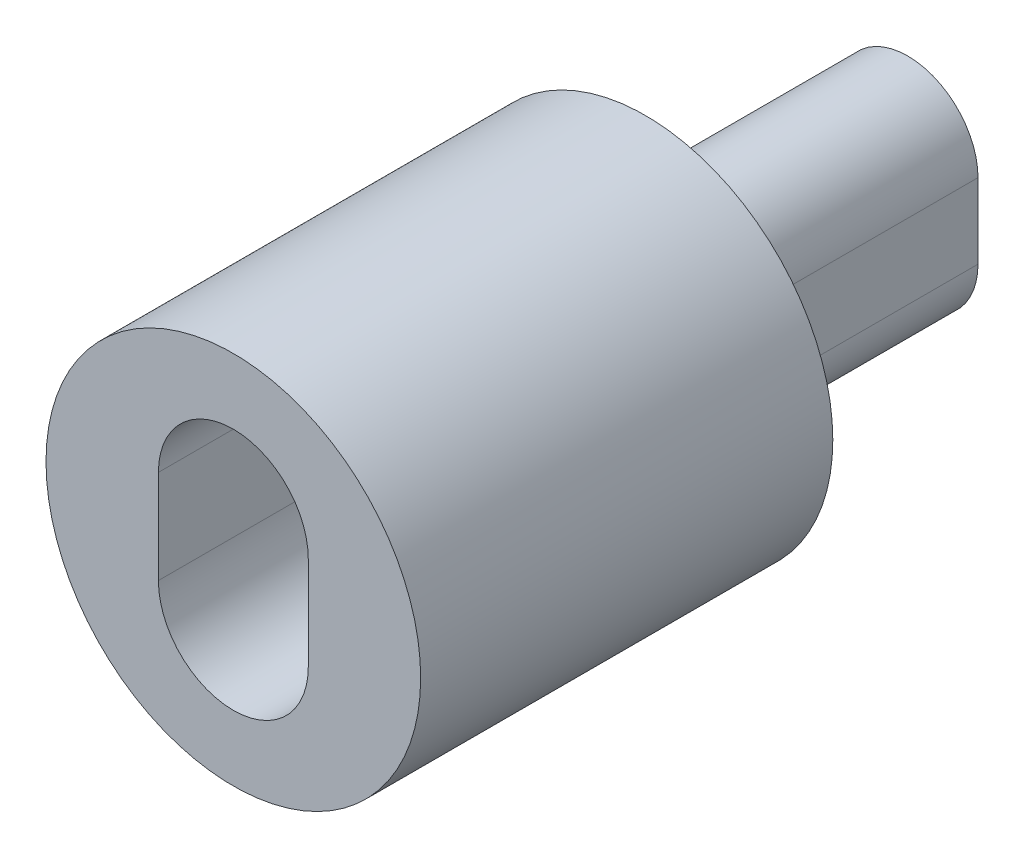
ISO-10303-21;
HEADER;
FILE_DESCRIPTION(('STEP AP214'),'2;1');
FILE_NAME('part.step','',(''),(''),'','','');
FILE_SCHEMA(('AUTOMOTIVE_DESIGN { 1 0 10303 214 1 1 1 1 }'));
ENDSEC;
DATA;
#1=APPLICATION_CONTEXT('core data for automotive mechanical design processes');
#2=APPLICATION_PROTOCOL_DEFINITION('international standard','automotive_design',2000,#1);
#3=PRODUCT_CONTEXT('',#1,'mechanical');
#4=PRODUCT('Part','Part','',(#3));
#5=PRODUCT_RELATED_PRODUCT_CATEGORY('part','',(#4));
#6=PRODUCT_DEFINITION_FORMATION('','',#4);
#7=PRODUCT_DEFINITION_CONTEXT('part definition',#1,'design');
#8=PRODUCT_DEFINITION('design','',#6,#7);
#9=PRODUCT_DEFINITION_SHAPE('','',#8);
#10=(LENGTH_UNIT() NAMED_UNIT(*) SI_UNIT(.MILLI.,.METRE.));
#11=(NAMED_UNIT(*) PLANE_ANGLE_UNIT() SI_UNIT($,.RADIAN.));
#12=(NAMED_UNIT(*) SI_UNIT($,.STERADIAN.) SOLID_ANGLE_UNIT());
#13=UNCERTAINTY_MEASURE_WITH_UNIT(LENGTH_MEASURE(1.E-05),#10,'distance_accuracy_value','');
#14=(GEOMETRIC_REPRESENTATION_CONTEXT(3) GLOBAL_UNCERTAINTY_ASSIGNED_CONTEXT((#13)) GLOBAL_UNIT_ASSIGNED_CONTEXT((#10,
#11,#12)) REPRESENTATION_CONTEXT('',''));
#15=CARTESIAN_POINT('',(0.,0.,0.));
#16=DIRECTION('',(0.,0.,1.));
#17=DIRECTION('',(1.,0.,0.));
#18=AXIS2_PLACEMENT_3D('',#15,#16,#17);
#19=CARTESIAN_POINT('',(-12.3173345144275,-23.1161122661123,0.));
#20=DIRECTION('',(0.,0.,1.));
#21=DIRECTION('',(1.,0.,0.));
#22=AXIS2_PLACEMENT_3D('',#19,#20,#21);
#23=PLANE('',#22);
#24=CARTESIAN_POINT('',(-12.3173345144275,-23.1161122661123,0.));
#25=DIRECTION('',(0.,0.,1.));
#26=DIRECTION('',(1.,0.,0.));
#27=AXIS2_PLACEMENT_3D('',#24,#25,#26);
#28=CIRCLE('',#27,5.);
#29=CARTESIAN_POINT('',(-7.31733451442754,-23.1161122661123,0.));
#30=VERTEX_POINT('',#29);
#31=EDGE_CURVE('E37',#30,#30,#28,.T.);
#32=ORIENTED_EDGE('',*,*,#31,.F.);
#33=EDGE_LOOP('',(#32));
#34=FACE_BOUND('',#33,.T.);
#35=CARTESIAN_POINT('',(-12.3173345144275,-24.1161122661123,0.));
#36=DIRECTION('',(0.,0.,-1.));
#37=DIRECTION('',(-1.,0.,0.));
#38=AXIS2_PLACEMENT_3D('',#35,#36,#37);
#39=CIRCLE('',#38,1.875);
#40=CARTESIAN_POINT('',(-10.4423345144275,-24.1161122661123,0.));
#41=VERTEX_POINT('',#40);
#42=CARTESIAN_POINT('',(-14.1923345144275,-24.1161122661123,0.));
#43=VERTEX_POINT('',#42);
#44=EDGE_CURVE('E48',#41,#43,#39,.T.);
#45=ORIENTED_EDGE('',*,*,#44,.F.);
#46=DIRECTION('',(0.,-1.,0.));
#47=VECTOR('',#46,1.);
#48=CARTESIAN_POINT('',(-10.4423345144275,-24.1161122661123,0.));
#49=LINE('',#48,#47);
#50=CARTESIAN_POINT('',(-10.4423345144275,-22.1161122661123,0.));
#51=VERTEX_POINT('',#50);
#52=EDGE_CURVE('E52',#51,#41,#49,.T.);
#53=ORIENTED_EDGE('',*,*,#52,.F.);
#54=CARTESIAN_POINT('',(-12.3173345144275,-22.1161122661123,0.));
#55=DIRECTION('',(0.,0.,-1.));
#56=DIRECTION('',(-1.,0.,0.));
#57=AXIS2_PLACEMENT_3D('',#54,#55,#56);
#58=CIRCLE('',#57,1.875);
#59=CARTESIAN_POINT('',(-14.1923345144275,-22.1161122661123,0.));
#60=VERTEX_POINT('',#59);
#61=EDGE_CURVE('E287',#60,#51,#58,.T.);
#62=ORIENTED_EDGE('',*,*,#61,.F.);
#63=DIRECTION('',(0.,1.,0.));
#64=VECTOR('',#63,1.);
#65=CARTESIAN_POINT('',(-14.1923345144275,-24.1161122661123,0.));
#66=LINE('',#65,#64);
#67=EDGE_CURVE('E293',#43,#60,#66,.T.);
#68=ORIENTED_EDGE('',*,*,#67,.F.);
#69=EDGE_LOOP('',(#45,#53,#62,#68));
#70=FACE_BOUND('',#69,.T.);
#71=ADVANCED_FACE('F33',(#34,#70),#23,.F.);
#72=CARTESIAN_POINT('',(-12.3173345144275,-23.1161122661123,11.));
#73=DIRECTION('',(0.,0.,-1.));
#74=DIRECTION('',(-1.,0.,0.));
#75=AXIS2_PLACEMENT_3D('',#72,#73,#74);
#76=CYLINDRICAL_SURFACE('',#75,5.);
#77=CARTESIAN_POINT('',(-12.3173345144275,-23.1161122661123,11.));
#78=DIRECTION('',(0.,0.,1.));
#79=DIRECTION('',(1.,0.,0.));
#80=AXIS2_PLACEMENT_3D('',#77,#78,#79);
#81=CIRCLE('',#80,5.);
#82=CARTESIAN_POINT('',(-7.31733451442754,-23.1161122661123,11.));
#83=VERTEX_POINT('',#82);
#84=EDGE_CURVE('E11',#83,#83,#81,.T.);
#85=ORIENTED_EDGE('',*,*,#84,.F.);
#86=EDGE_LOOP('',(#85));
#87=FACE_BOUND('',#86,.T.);
#88=ORIENTED_EDGE('',*,*,#31,.T.);
#89=EDGE_LOOP('',(#88));
#90=FACE_BOUND('',#89,.T.);
#91=ADVANCED_FACE('F35',(#87,#90),#76,.T.);
#92=CARTESIAN_POINT('',(-12.3173345144275,-23.1161122661123,11.));
#93=DIRECTION('',(0.,0.,1.));
#94=DIRECTION('',(1.,0.,0.));
#95=AXIS2_PLACEMENT_3D('',#92,#93,#94);
#96=PLANE('',#95);
#97=CARTESIAN_POINT('',(-12.3173345144275,-24.3661122661123,11.));
#98=DIRECTION('',(0.,0.,1.));
#99=DIRECTION('',(1.,0.,0.));
#100=AXIS2_PLACEMENT_3D('',#97,#98,#99);
#101=CIRCLE('',#100,2.);
#102=CARTESIAN_POINT('',(-14.3173345144275,-24.3661122661123,11.));
#103=VERTEX_POINT('',#102);
#104=CARTESIAN_POINT('',(-10.3173345144275,-24.3661122661123,11.));
#105=VERTEX_POINT('',#104);
#106=EDGE_CURVE('E118',#103,#105,#101,.T.);
#107=ORIENTED_EDGE('',*,*,#106,.F.);
#108=DIRECTION('',(0.,-1.,0.));
#109=VECTOR('',#108,1.);
#110=CARTESIAN_POINT('',(-14.3173345144275,-24.3661122661123,11.));
#111=LINE('',#110,#109);
#112=CARTESIAN_POINT('',(-14.3173345144275,-21.8661122661123,11.));
#113=VERTEX_POINT('',#112);
#114=EDGE_CURVE('E130',#113,#103,#111,.T.);
#115=ORIENTED_EDGE('',*,*,#114,.F.);
#116=CARTESIAN_POINT('',(-12.3173345144275,-21.8661122661123,11.));
#117=DIRECTION('',(0.,0.,1.));
#118=DIRECTION('',(1.,0.,0.));
#119=AXIS2_PLACEMENT_3D('',#116,#117,#118);
#120=CIRCLE('',#119,2.);
#121=CARTESIAN_POINT('',(-10.3173345144275,-21.8661122661123,11.));
#122=VERTEX_POINT('',#121);
#123=EDGE_CURVE('E142',#122,#113,#120,.T.);
#124=ORIENTED_EDGE('',*,*,#123,.F.);
#125=DIRECTION('',(0.,1.,0.));
#126=VECTOR('',#125,1.);
#127=CARTESIAN_POINT('',(-10.3173345144275,-24.3661122661123,11.));
#128=LINE('',#127,#126);
#129=EDGE_CURVE('E120',#105,#122,#128,.T.);
#130=ORIENTED_EDGE('',*,*,#129,.F.);
#131=EDGE_LOOP('',(#107,#115,#124,#130));
#132=FACE_BOUND('',#131,.T.);
#133=ORIENTED_EDGE('',*,*,#84,.T.);
#134=EDGE_LOOP('',(#133));
#135=FACE_BOUND('',#134,.T.);
#136=ADVANCED_FACE('F163',(#132,#135),#96,.T.);
#137=CARTESIAN_POINT('',(-12.3173345144275,-24.3661122661123,3.));
#138=DIRECTION('',(0.,0.,1.));
#139=DIRECTION('',(1.,0.,0.));
#140=AXIS2_PLACEMENT_3D('',#137,#138,#139);
#141=CYLINDRICAL_SURFACE('',#140,2.);
#142=ORIENTED_EDGE('',*,*,#106,.T.);
#143=DIRECTION('',(0.,0.,1.));
#144=VECTOR('',#143,1.);
#145=CARTESIAN_POINT('',(-10.3173345144275,-24.3661122661123,3.));
#146=LINE('',#145,#144);
#147=CARTESIAN_POINT('',(-10.3173345144275,-24.3661122661123,3.));
#148=VERTEX_POINT('',#147);
#149=EDGE_CURVE('E138',#148,#105,#146,.T.);
#150=ORIENTED_EDGE('',*,*,#149,.F.);
#151=CARTESIAN_POINT('',(-12.3173345144275,-24.3661122661123,3.));
#152=DIRECTION('',(0.,0.,1.));
#153=DIRECTION('',(1.,0.,0.));
#154=AXIS2_PLACEMENT_3D('',#151,#152,#153);
#155=CIRCLE('',#154,2.);
#156=CARTESIAN_POINT('',(-14.3173345144275,-24.3661122661123,3.));
#157=VERTEX_POINT('',#156);
#158=EDGE_CURVE('E126',#157,#148,#155,.T.);
#159=ORIENTED_EDGE('',*,*,#158,.F.);
#160=DIRECTION('',(0.,0.,1.));
#161=VECTOR('',#160,1.);
#162=CARTESIAN_POINT('',(-14.3173345144275,-24.3661122661123,3.));
#163=LINE('',#162,#161);
#164=EDGE_CURVE('E147',#157,#103,#163,.T.);
#165=ORIENTED_EDGE('',*,*,#164,.T.);
#166=EDGE_LOOP('',(#142,#150,#159,#165));
#167=FACE_BOUND('',#166,.T.);
#168=ADVANCED_FACE('F172',(#167),#141,.F.);
#169=CARTESIAN_POINT('',(-14.3173345144275,-24.3661122661123,3.));
#170=DIRECTION('',(-1.,0.,0.));
#171=DIRECTION('',(0.,0.,1.));
#172=AXIS2_PLACEMENT_3D('',#169,#170,#171);
#173=PLANE('',#172);
#174=ORIENTED_EDGE('',*,*,#114,.T.);
#175=ORIENTED_EDGE('',*,*,#164,.F.);
#176=DIRECTION('',(0.,-1.,0.));
#177=VECTOR('',#176,1.);
#178=CARTESIAN_POINT('',(-14.3173345144275,-24.3661122661123,3.));
#179=LINE('',#178,#177);
#180=CARTESIAN_POINT('',(-14.3173345144275,-21.8661122661123,3.));
#181=VERTEX_POINT('',#180);
#182=EDGE_CURVE('E136',#181,#157,#179,.T.);
#183=ORIENTED_EDGE('',*,*,#182,.F.);
#184=DIRECTION('',(0.,0.,1.));
#185=VECTOR('',#184,1.);
#186=CARTESIAN_POINT('',(-14.3173345144275,-21.8661122661123,3.));
#187=LINE('',#186,#185);
#188=EDGE_CURVE('E149',#181,#113,#187,.T.);
#189=ORIENTED_EDGE('',*,*,#188,.T.);
#190=EDGE_LOOP('',(#174,#175,#183,#189));
#191=FACE_BOUND('',#190,.T.);
#192=ADVANCED_FACE('F174',(#191),#173,.F.);
#193=CARTESIAN_POINT('',(-12.3173345144275,-21.8661122661123,3.));
#194=DIRECTION('',(0.,0.,1.));
#195=DIRECTION('',(1.,0.,0.));
#196=AXIS2_PLACEMENT_3D('',#193,#194,#195);
#197=CYLINDRICAL_SURFACE('',#196,2.);
#198=ORIENTED_EDGE('',*,*,#123,.T.);
#199=ORIENTED_EDGE('',*,*,#188,.F.);
#200=CARTESIAN_POINT('',(-12.3173345144275,-21.8661122661123,3.));
#201=DIRECTION('',(0.,0.,1.));
#202=DIRECTION('',(1.,0.,0.));
#203=AXIS2_PLACEMENT_3D('',#200,#201,#202);
#204=CIRCLE('',#203,2.);
#205=CARTESIAN_POINT('',(-10.3173345144275,-21.8661122661123,3.));
#206=VERTEX_POINT('',#205);
#207=EDGE_CURVE('E133',#206,#181,#204,.T.);
#208=ORIENTED_EDGE('',*,*,#207,.F.);
#209=DIRECTION('',(0.,0.,1.));
#210=VECTOR('',#209,1.);
#211=CARTESIAN_POINT('',(-10.3173345144275,-21.8661122661123,3.));
#212=LINE('',#211,#210);
#213=EDGE_CURVE('E151',#206,#122,#212,.T.);
#214=ORIENTED_EDGE('',*,*,#213,.T.);
#215=EDGE_LOOP('',(#198,#199,#208,#214));
#216=FACE_BOUND('',#215,.T.);
#217=ADVANCED_FACE('F167',(#216),#197,.F.);
#218=CARTESIAN_POINT('',(-10.3173345144275,-24.3661122661123,3.));
#219=DIRECTION('',(1.,0.,0.));
#220=DIRECTION('',(0.,0.,-1.));
#221=AXIS2_PLACEMENT_3D('',#218,#219,#220);
#222=PLANE('',#221);
#223=ORIENTED_EDGE('',*,*,#129,.T.);
#224=ORIENTED_EDGE('',*,*,#213,.F.);
#225=DIRECTION('',(0.,1.,0.));
#226=VECTOR('',#225,1.);
#227=CARTESIAN_POINT('',(-10.3173345144275,-24.3661122661123,3.));
#228=LINE('',#227,#226);
#229=EDGE_CURVE('E129',#148,#206,#228,.T.);
#230=ORIENTED_EDGE('',*,*,#229,.F.);
#231=ORIENTED_EDGE('',*,*,#149,.T.);
#232=EDGE_LOOP('',(#223,#224,#230,#231));
#233=FACE_BOUND('',#232,.T.);
#234=ADVANCED_FACE('F157',(#233),#222,.F.);
#235=CARTESIAN_POINT('',(-12.3173345144275,-24.3661122661123,3.));
#236=DIRECTION('',(0.,0.,1.));
#237=DIRECTION('',(1.,0.,0.));
#238=AXIS2_PLACEMENT_3D('',#235,#236,#237);
#239=PLANE('',#238);
#240=ORIENTED_EDGE('',*,*,#158,.T.);
#241=ORIENTED_EDGE('',*,*,#229,.T.);
#242=ORIENTED_EDGE('',*,*,#207,.T.);
#243=ORIENTED_EDGE('',*,*,#182,.T.);
#244=EDGE_LOOP('',(#240,#241,#242,#243));
#245=FACE_BOUND('',#244,.T.);
#246=ADVANCED_FACE('F171',(#245),#239,.T.);
#247=CARTESIAN_POINT('',(-12.3173345144275,-24.1161122661123,-7.));
#248=DIRECTION('',(0.,0.,1.));
#249=DIRECTION('',(1.,0.,0.));
#250=AXIS2_PLACEMENT_3D('',#247,#248,#249);
#251=CYLINDRICAL_SURFACE('',#250,1.875);
#252=ORIENTED_EDGE('',*,*,#44,.T.);
#253=DIRECTION('',(0.,0.,1.));
#254=VECTOR('',#253,1.);
#255=CARTESIAN_POINT('',(-14.1923345144275,-24.1161122661123,-7.));
#256=LINE('',#255,#254);
#257=CARTESIAN_POINT('',(-14.1923345144275,-24.1161122661123,-7.));
#258=VERTEX_POINT('',#257);
#259=EDGE_CURVE('E101',#258,#43,#256,.T.);
#260=ORIENTED_EDGE('',*,*,#259,.F.);
#261=CARTESIAN_POINT('',(-12.3173345144275,-24.1161122661123,-7.));
#262=DIRECTION('',(0.,0.,-1.));
#263=DIRECTION('',(-1.,0.,0.));
#264=AXIS2_PLACEMENT_3D('',#261,#262,#263);
#265=CIRCLE('',#264,1.875);
#266=CARTESIAN_POINT('',(-10.4423345144275,-24.1161122661123,-7.));
#267=VERTEX_POINT('',#266);
#268=EDGE_CURVE('E107',#267,#258,#265,.T.);
#269=ORIENTED_EDGE('',*,*,#268,.F.);
#270=DIRECTION('',(0.,0.,1.));
#271=VECTOR('',#270,1.);
#272=CARTESIAN_POINT('',(-10.4423345144275,-24.1161122661123,-7.));
#273=LINE('',#272,#271);
#274=EDGE_CURVE('E285',#267,#41,#273,.T.);
#275=ORIENTED_EDGE('',*,*,#274,.T.);
#276=EDGE_LOOP('',(#252,#260,#269,#275));
#277=FACE_BOUND('',#276,.T.);
#278=ADVANCED_FACE('F117',(#277),#251,.T.);
#279=CARTESIAN_POINT('',(-14.1923345144275,-24.1161122661123,-7.));
#280=DIRECTION('',(1.,0.,0.));
#281=DIRECTION('',(0.,0.,-1.));
#282=AXIS2_PLACEMENT_3D('',#279,#280,#281);
#283=PLANE('',#282);
#284=ORIENTED_EDGE('',*,*,#67,.T.);
#285=DIRECTION('',(0.,0.,1.));
#286=VECTOR('',#285,1.);
#287=CARTESIAN_POINT('',(-14.1923345144275,-22.1161122661123,-7.));
#288=LINE('',#287,#286);
#289=CARTESIAN_POINT('',(-14.1923345144275,-22.1161122661123,-7.));
#290=VERTEX_POINT('',#289);
#291=EDGE_CURVE('E103',#290,#60,#288,.T.);
#292=ORIENTED_EDGE('',*,*,#291,.F.);
#293=DIRECTION('',(0.,1.,0.));
#294=VECTOR('',#293,1.);
#295=CARTESIAN_POINT('',(-14.1923345144275,-24.1161122661123,-7.));
#296=LINE('',#295,#294);
#297=EDGE_CURVE('E96',#258,#290,#296,.T.);
#298=ORIENTED_EDGE('',*,*,#297,.F.);
#299=ORIENTED_EDGE('',*,*,#259,.T.);
#300=EDGE_LOOP('',(#284,#292,#298,#299));
#301=FACE_BOUND('',#300,.T.);
#302=ADVANCED_FACE('F99',(#301),#283,.F.);
#303=CARTESIAN_POINT('',(-12.3173345144275,-22.1161122661123,-7.));
#304=DIRECTION('',(0.,0.,1.));
#305=DIRECTION('',(1.,0.,0.));
#306=AXIS2_PLACEMENT_3D('',#303,#304,#305);
#307=CYLINDRICAL_SURFACE('',#306,1.875);
#308=ORIENTED_EDGE('',*,*,#61,.T.);
#309=DIRECTION('',(0.,0.,1.));
#310=VECTOR('',#309,1.);
#311=CARTESIAN_POINT('',(-10.4423345144275,-22.1161122661123,-7.));
#312=LINE('',#311,#310);
#313=CARTESIAN_POINT('',(-10.4423345144275,-22.1161122661123,-7.));
#314=VERTEX_POINT('',#313);
#315=EDGE_CURVE('E122',#314,#51,#312,.T.);
#316=ORIENTED_EDGE('',*,*,#315,.F.);
#317=CARTESIAN_POINT('',(-12.3173345144275,-22.1161122661123,-7.));
#318=DIRECTION('',(0.,0.,-1.));
#319=DIRECTION('',(-1.,0.,0.));
#320=AXIS2_PLACEMENT_3D('',#317,#318,#319);
#321=CIRCLE('',#320,1.875);
#322=EDGE_CURVE('E106',#290,#314,#321,.T.);
#323=ORIENTED_EDGE('',*,*,#322,.F.);
#324=ORIENTED_EDGE('',*,*,#291,.T.);
#325=EDGE_LOOP('',(#308,#316,#323,#324));
#326=FACE_BOUND('',#325,.T.);
#327=ADVANCED_FACE('F205',(#326),#307,.T.);
#328=CARTESIAN_POINT('',(-10.4423345144275,-24.1161122661123,-7.));
#329=DIRECTION('',(-1.,0.,0.));
#330=DIRECTION('',(0.,0.,1.));
#331=AXIS2_PLACEMENT_3D('',#328,#329,#330);
#332=PLANE('',#331);
#333=ORIENTED_EDGE('',*,*,#52,.T.);
#334=ORIENTED_EDGE('',*,*,#274,.F.);
#335=DIRECTION('',(0.,-1.,0.));
#336=VECTOR('',#335,1.);
#337=CARTESIAN_POINT('',(-10.4423345144275,-24.1161122661123,-7.));
#338=LINE('',#337,#336);
#339=EDGE_CURVE('E112',#314,#267,#338,.T.);
#340=ORIENTED_EDGE('',*,*,#339,.F.);
#341=ORIENTED_EDGE('',*,*,#315,.T.);
#342=EDGE_LOOP('',(#333,#334,#340,#341));
#343=FACE_BOUND('',#342,.T.);
#344=ADVANCED_FACE('F208',(#343),#332,.F.);
#345=CARTESIAN_POINT('',(-12.3173345144275,-24.1161122661123,-7.));
#346=DIRECTION('',(0.,0.,-1.));
#347=DIRECTION('',(-1.,0.,0.));
#348=AXIS2_PLACEMENT_3D('',#345,#346,#347);
#349=PLANE('',#348);
#350=ORIENTED_EDGE('',*,*,#268,.T.);
#351=ORIENTED_EDGE('',*,*,#297,.T.);
#352=ORIENTED_EDGE('',*,*,#322,.T.);
#353=ORIENTED_EDGE('',*,*,#339,.T.);
#354=EDGE_LOOP('',(#350,#351,#352,#353));
#355=FACE_BOUND('',#354,.T.);
#356=ADVANCED_FACE('F110',(#355),#349,.T.);
#357=CLOSED_SHELL('',(#71,#91,#136,#168,#192,#217,#234,#246,#278,#302,#327,#344,#356));
#358=MANIFOLD_SOLID_BREP('B2',#357);
#359=ADVANCED_BREP_SHAPE_REPRESENTATION('',(#18,#358),#14);
#360=SHAPE_DEFINITION_REPRESENTATION(#9,#359);
ENDSEC;
END-ISO-10303-21;
